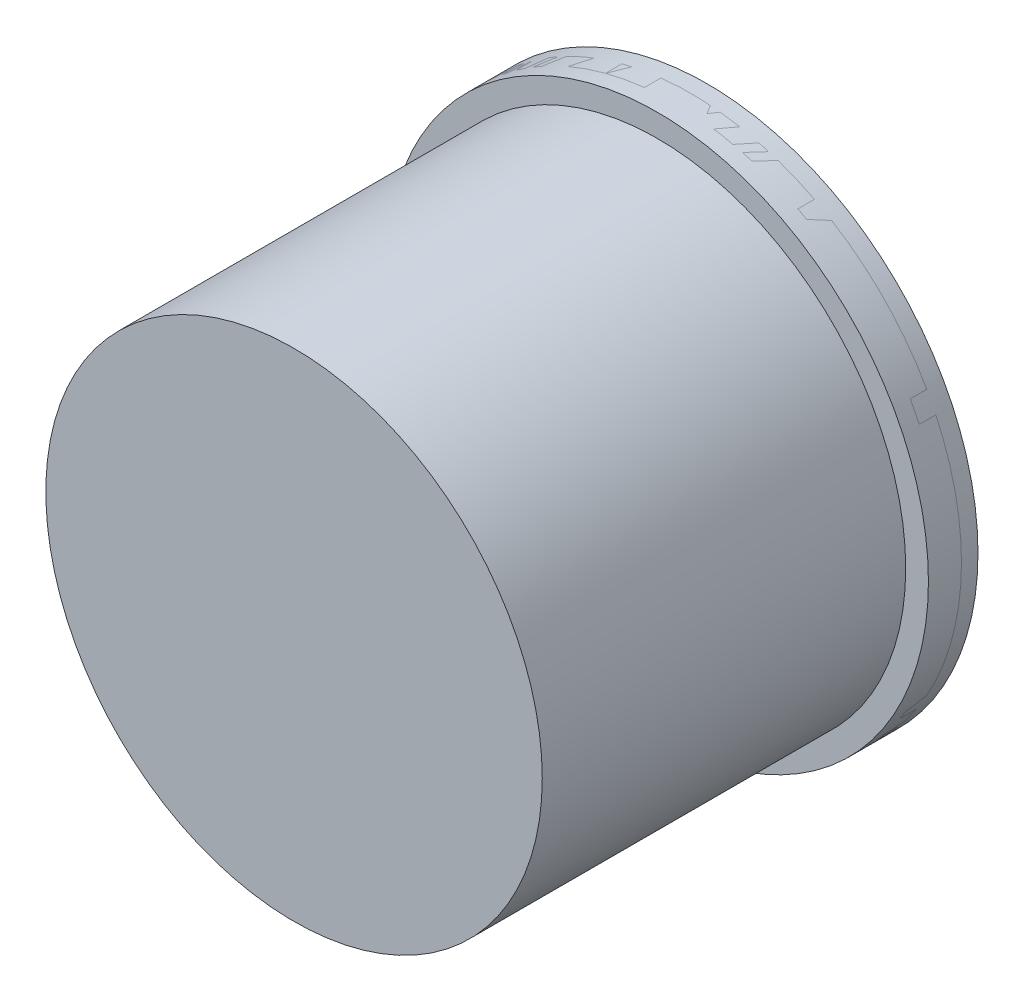
ISO-10303-21;
HEADER;
FILE_DESCRIPTION(('STEP AP214'),'2;1');
FILE_NAME('part.step','',(''),(''),'','','');
FILE_SCHEMA(('AUTOMOTIVE_DESIGN { 1 0 10303 214 1 1 1 1 }'));
ENDSEC;
DATA;
#1=APPLICATION_CONTEXT('core data for automotive mechanical design processes');
#2=APPLICATION_PROTOCOL_DEFINITION('international standard','automotive_design',2000,#1);
#3=PRODUCT_CONTEXT('',#1,'mechanical');
#4=PRODUCT('Part','Part','',(#3));
#5=PRODUCT_RELATED_PRODUCT_CATEGORY('part','',(#4));
#6=PRODUCT_DEFINITION_FORMATION('','',#4);
#7=PRODUCT_DEFINITION_CONTEXT('part definition',#1,'design');
#8=PRODUCT_DEFINITION('design','',#6,#7);
#9=PRODUCT_DEFINITION_SHAPE('','',#8);
#10=(LENGTH_UNIT() NAMED_UNIT(*) SI_UNIT(.MILLI.,.METRE.));
#11=(NAMED_UNIT(*) PLANE_ANGLE_UNIT() SI_UNIT($,.RADIAN.));
#12=(NAMED_UNIT(*) SI_UNIT($,.STERADIAN.) SOLID_ANGLE_UNIT());
#13=UNCERTAINTY_MEASURE_WITH_UNIT(LENGTH_MEASURE(1.E-05),#10,'distance_accuracy_value','');
#14=(GEOMETRIC_REPRESENTATION_CONTEXT(3) GLOBAL_UNCERTAINTY_ASSIGNED_CONTEXT((#13)) GLOBAL_UNIT_ASSIGNED_CONTEXT((#10,
#11,#12)) REPRESENTATION_CONTEXT('',''));
#15=CARTESIAN_POINT('',(0.,0.,0.));
#16=DIRECTION('',(0.,0.,1.));
#17=DIRECTION('',(1.,0.,0.));
#18=AXIS2_PLACEMENT_3D('',#15,#16,#17);
#19=CARTESIAN_POINT('',(0.,0.,-8.5));
#20=DIRECTION('',(0.,0.,1.));
#21=DIRECTION('',(1.,0.,0.));
#22=AXIS2_PLACEMENT_3D('',#19,#20,#21);
#23=CYLINDRICAL_SURFACE('',#22,16.4);
#24=CARTESIAN_POINT('',(0.,0.,-7.5));
#25=DIRECTION('',(0.,0.,-1.));
#26=DIRECTION('',(-1.,0.,0.));
#27=AXIS2_PLACEMENT_3D('',#24,#25,#26);
#28=CIRCLE('',#27,16.4);
#29=CARTESIAN_POINT('',(-16.4,0.,-7.5));
#30=VERTEX_POINT('',#29);
#31=EDGE_CURVE('P0_E47',#30,#30,#28,.T.);
#32=ORIENTED_EDGE('',*,*,#31,.F.);
#33=EDGE_LOOP('',(#32));
#34=FACE_BOUND('',#33,.T.);
#35=CARTESIAN_POINT('',(0.,0.,-5.5));
#36=DIRECTION('',(0.,0.,1.));
#37=DIRECTION('',(1.,0.,0.));
#38=AXIS2_PLACEMENT_3D('',#35,#36,#37);
#39=CIRCLE('',#38,16.4);
#40=CARTESIAN_POINT('',(16.4,0.,-5.5));
#41=VERTEX_POINT('',#40);
#42=EDGE_CURVE('P0_E61',#41,#41,#39,.T.);
#43=ORIENTED_EDGE('',*,*,#42,.F.);
#44=EDGE_LOOP('',(#43));
#45=FACE_BOUND('',#44,.T.);
#46=ADVANCED_FACE('P0_F44',(#34,#45),#23,.T.);
#47=CARTESIAN_POINT('',(0.,0.,-7.5));
#48=DIRECTION('',(0.,0.,-1.));
#49=DIRECTION('',(-1.,0.,0.));
#50=AXIS2_PLACEMENT_3D('',#47,#48,#49);
#51=PLANE('',#50);
#52=CARTESIAN_POINT('',(0.,0.,-7.5));
#53=DIRECTION('',(0.,0.,-1.));
#54=DIRECTION('',(-1.,0.,0.));
#55=AXIS2_PLACEMENT_3D('',#52,#53,#54);
#56=CIRCLE('',#55,6.05);
#57=CARTESIAN_POINT('',(-6.05,0.,-7.5));
#58=VERTEX_POINT('',#57);
#59=EDGE_CURVE('P0_E10',#58,#58,#56,.T.);
#60=ORIENTED_EDGE('',*,*,#59,.F.);
#61=EDGE_LOOP('',(#60));
#62=FACE_BOUND('',#61,.T.);
#63=ORIENTED_EDGE('',*,*,#31,.T.);
#64=EDGE_LOOP('',(#63));
#65=FACE_BOUND('',#64,.T.);
#66=ADVANCED_FACE('P0_F88',(#62,#65),#51,.T.);
#67=CARTESIAN_POINT('',(0.,0.,-13.));
#68=DIRECTION('',(0.,0.,1.));
#69=DIRECTION('',(1.,0.,0.));
#70=AXIS2_PLACEMENT_3D('',#67,#68,#69);
#71=CYLINDRICAL_SURFACE('',#70,6.05);
#72=CARTESIAN_POINT('',(0.,0.,-13.));
#73=DIRECTION('',(0.,0.,-1.));
#74=DIRECTION('',(-1.,0.,0.));
#75=AXIS2_PLACEMENT_3D('',#72,#73,#74);
#76=CIRCLE('',#75,6.05);
#77=CARTESIAN_POINT('',(-6.05,0.,-13.));
#78=VERTEX_POINT('',#77);
#79=EDGE_CURVE('P0_E54',#78,#78,#76,.T.);
#80=ORIENTED_EDGE('',*,*,#79,.F.);
#81=EDGE_LOOP('',(#80));
#82=FACE_BOUND('',#81,.T.);
#83=ORIENTED_EDGE('',*,*,#59,.T.);
#84=EDGE_LOOP('',(#83));
#85=FACE_BOUND('',#84,.T.);
#86=ADVANCED_FACE('P0_F83',(#82,#85),#71,.T.);
#87=CARTESIAN_POINT('',(0.,0.,-13.));
#88=DIRECTION('',(0.,0.,-1.));
#89=DIRECTION('',(-1.,0.,0.));
#90=AXIS2_PLACEMENT_3D('',#87,#88,#89);
#91=PLANE('',#90);
#92=ORIENTED_EDGE('',*,*,#79,.T.);
#93=EDGE_LOOP('',(#92));
#94=FACE_BOUND('',#93,.T.);
#95=ADVANCED_FACE('P0_F74',(#94),#91,.T.);
#96=CARTESIAN_POINT('',(0.,0.,-5.5));
#97=DIRECTION('',(0.,0.,1.));
#98=DIRECTION('',(1.,0.,0.));
#99=AXIS2_PLACEMENT_3D('',#96,#97,#98);
#100=PLANE('',#99);
#101=ORIENTED_EDGE('',*,*,#42,.T.);
#102=EDGE_LOOP('',(#101));
#103=FACE_BOUND('',#102,.T.);
#104=CARTESIAN_POINT('',(0.,0.,-5.5));
#105=DIRECTION('',(0.,0.,1.));
#106=DIRECTION('',(1.,0.,0.));
#107=AXIS2_PLACEMENT_3D('',#104,#105,#106);
#108=CIRCLE('',#107,15.025);
#109=CARTESIAN_POINT('',(15.025,0.,-5.5));
#110=VERTEX_POINT('',#109);
#111=EDGE_CURVE('P0_E64',#110,#110,#108,.T.);
#112=ORIENTED_EDGE('',*,*,#111,.F.);
#113=EDGE_LOOP('',(#112));
#114=FACE_BOUND('',#113,.T.);
#115=ADVANCED_FACE('P0_F71',(#103,#114),#100,.T.);
#116=CARTESIAN_POINT('',(0.,0.,16.5));
#117=DIRECTION('',(0.,0.,1.));
#118=DIRECTION('',(1.,0.,0.));
#119=AXIS2_PLACEMENT_3D('',#116,#117,#118);
#120=PLANE('',#119);
#121=CARTESIAN_POINT('',(0.,0.,16.5));
#122=DIRECTION('',(0.,0.,1.));
#123=DIRECTION('',(1.,0.,0.));
#124=AXIS2_PLACEMENT_3D('',#121,#122,#123);
#125=CIRCLE('',#124,15.025);
#126=CARTESIAN_POINT('',(15.025,0.,16.5));
#127=VERTEX_POINT('',#126);
#128=EDGE_CURVE('P0_E58',#127,#127,#125,.T.);
#129=ORIENTED_EDGE('',*,*,#128,.T.);
#130=EDGE_LOOP('',(#129));
#131=FACE_BOUND('',#130,.T.);
#132=ADVANCED_FACE('P0_F73',(#131),#120,.T.);
#133=CARTESIAN_POINT('',(0.,0.,16.5));
#134=DIRECTION('',(0.,0.,-1.));
#135=DIRECTION('',(-1.,0.,0.));
#136=AXIS2_PLACEMENT_3D('',#133,#134,#135);
#137=CYLINDRICAL_SURFACE('',#136,15.025);
#138=ORIENTED_EDGE('',*,*,#111,.T.);
#139=EDGE_LOOP('',(#138));
#140=FACE_BOUND('',#139,.T.);
#141=ORIENTED_EDGE('',*,*,#128,.F.);
#142=EDGE_LOOP('',(#141));
#143=FACE_BOUND('',#142,.T.);
#144=ADVANCED_FACE('P0_F68',(#140,#143),#137,.T.);
#145=CLOSED_SHELL('',(#46,#66,#86,#95,#115,#132,#144));
#146=MANIFOLD_SOLID_BREP('P0_B2',#145);
#147=CARTESIAN_POINT('',(0.,13.5,8.5));
#148=DIRECTION('',(0.,0.,1.));
#149=DIRECTION('',(1.,0.,0.));
#150=AXIS2_PLACEMENT_3D('',#147,#148,#149);
#151=CONICAL_SURFACE('',#150,1.25,0.785398162500002);
#152=CARTESIAN_POINT('',(0.,13.5,8.5));
#153=DIRECTION('',(0.,0.,-1.));
#154=DIRECTION('',(1.,0.,0.));
#155=AXIS2_PLACEMENT_3D('',#152,#153,#154);
#156=CIRCLE('',#155,1.25);
#157=CARTESIAN_POINT('',(1.25000000000005,13.5,8.5));
#158=VERTEX_POINT('',#157);
#159=EDGE_CURVE('P1_E20',#158,#158,#156,.T.);
#160=ORIENTED_EDGE('',*,*,#159,.F.);
#161=EDGE_LOOP('',(#160));
#162=FACE_BOUND('',#161,.T.);
#163=CARTESIAN_POINT('',(0.,13.5,8.275));
#164=DIRECTION('',(0.,0.,1.));
#165=DIRECTION('',(1.,0.,0.));
#166=AXIS2_PLACEMENT_3D('',#163,#164,#165);
#167=CIRCLE('',#166,1.025);
#168=CARTESIAN_POINT('',(1.02500000000005,13.5,8.275));
#169=VERTEX_POINT('',#168);
#170=EDGE_CURVE('P1_E11',#169,#169,#167,.T.);
#171=ORIENTED_EDGE('',*,*,#170,.F.);
#172=EDGE_LOOP('',(#171));
#173=FACE_BOUND('',#172,.T.);
#174=ADVANCED_FACE('P1_F16',(#162,#173),#151,.F.);
#175=CARTESIAN_POINT('',(0.,13.5,8.5));
#176=DIRECTION('',(0.,0.,-1.));
#177=DIRECTION('',(-1.,0.,0.));
#178=AXIS2_PLACEMENT_3D('',#175,#176,#177);
#179=CYLINDRICAL_SURFACE('',#178,1.025);
#180=CARTESIAN_POINT('',(0.,13.5,3.5));
#181=DIRECTION('',(0.,0.,1.));
#182=DIRECTION('',(-1.,0.,0.));
#183=AXIS2_PLACEMENT_3D('',#180,#181,#182);
#184=CIRCLE('',#183,1.025);
#185=CARTESIAN_POINT('',(-1.02499999999995,13.5,3.5));
#186=VERTEX_POINT('',#185);
#187=EDGE_CURVE('P1_E27',#186,#186,#184,.T.);
#188=ORIENTED_EDGE('',*,*,#187,.F.);
#189=EDGE_LOOP('',(#188));
#190=FACE_BOUND('',#189,.T.);
#191=ORIENTED_EDGE('',*,*,#170,.T.);
#192=EDGE_LOOP('',(#191));
#193=FACE_BOUND('',#192,.T.);
#194=ADVANCED_FACE('P1_F212',(#190,#193),#179,.F.);
#195=CARTESIAN_POINT('',(0.,13.5,3.5));
#196=DIRECTION('',(0.,0.,1.));
#197=DIRECTION('',(1.,0.,0.));
#198=AXIS2_PLACEMENT_3D('',#195,#196,#197);
#199=CONICAL_SURFACE('',#198,1.025,1.0297442575);
#200=CARTESIAN_POINT('',(0.,13.5,2.88411786549675));
#201=VERTEX_POINT('',#200);
#202=VERTEX_LOOP('',#201);
#203=FACE_BOUND('',#202,.T.);
#204=ORIENTED_EDGE('',*,*,#187,.T.);
#205=EDGE_LOOP('',(#204));
#206=FACE_BOUND('',#205,.T.);
#207=ADVANCED_FACE('P1_F218',(#203,#206),#199,.F.);
#208=CARTESIAN_POINT('',(13.5,0.,8.5));
#209=DIRECTION('',(0.,0.,1.));
#210=DIRECTION('',(1.,0.,0.));
#211=AXIS2_PLACEMENT_3D('',#208,#209,#210);
#212=CONICAL_SURFACE('',#211,1.25,0.7853981625);
#213=CARTESIAN_POINT('',(13.5,0.,8.5));
#214=DIRECTION('',(0.,0.,-1.));
#215=DIRECTION('',(1.,0.,0.));
#216=AXIS2_PLACEMENT_3D('',#213,#214,#215);
#217=CIRCLE('',#216,1.25);
#218=CARTESIAN_POINT('',(14.75,0.,8.5));
#219=VERTEX_POINT('',#218);
#220=EDGE_CURVE('P1_E167',#219,#219,#217,.T.);
#221=ORIENTED_EDGE('',*,*,#220,.F.);
#222=EDGE_LOOP('',(#221));
#223=FACE_BOUND('',#222,.T.);
#224=CARTESIAN_POINT('',(13.5,0.,8.275));
#225=DIRECTION('',(0.,0.,1.));
#226=DIRECTION('',(1.,0.,0.));
#227=AXIS2_PLACEMENT_3D('',#224,#225,#226);
#228=CIRCLE('',#227,1.025);
#229=CARTESIAN_POINT('',(14.525,0.,8.275));
#230=VERTEX_POINT('',#229);
#231=EDGE_CURVE('P1_E121',#230,#230,#228,.T.);
#232=ORIENTED_EDGE('',*,*,#231,.F.);
#233=EDGE_LOOP('',(#232));
#234=FACE_BOUND('',#233,.T.);
#235=ADVANCED_FACE('P1_F223',(#223,#234),#212,.F.);
#236=CARTESIAN_POINT('',(13.5,0.,8.5));
#237=DIRECTION('',(0.,0.,-1.));
#238=DIRECTION('',(-1.,0.,0.));
#239=AXIS2_PLACEMENT_3D('',#236,#237,#238);
#240=CYLINDRICAL_SURFACE('',#239,1.025);
#241=CARTESIAN_POINT('',(13.5,0.,3.5));
#242=DIRECTION('',(0.,0.,1.));
#243=DIRECTION('',(-1.,0.,0.));
#244=AXIS2_PLACEMENT_3D('',#241,#242,#243);
#245=CIRCLE('',#244,1.025);
#246=CARTESIAN_POINT('',(12.475,0.,3.5));
#247=VERTEX_POINT('',#246);
#248=EDGE_CURVE('P1_E125',#247,#247,#245,.T.);
#249=ORIENTED_EDGE('',*,*,#248,.F.);
#250=EDGE_LOOP('',(#249));
#251=FACE_BOUND('',#250,.T.);
#252=ORIENTED_EDGE('',*,*,#231,.T.);
#253=EDGE_LOOP('',(#252));
#254=FACE_BOUND('',#253,.T.);
#255=ADVANCED_FACE('P1_F122',(#251,#254),#240,.F.);
#256=CARTESIAN_POINT('',(13.5,0.,3.5));
#257=DIRECTION('',(0.,0.,1.));
#258=DIRECTION('',(1.,0.,0.));
#259=AXIS2_PLACEMENT_3D('',#256,#257,#258);
#260=CONICAL_SURFACE('',#259,1.025,1.0297442575);
#261=CARTESIAN_POINT('',(13.5,0.,2.88411786549675));
#262=VERTEX_POINT('',#261);
#263=VERTEX_LOOP('',#262);
#264=FACE_BOUND('',#263,.T.);
#265=ORIENTED_EDGE('',*,*,#248,.T.);
#266=EDGE_LOOP('',(#265));
#267=FACE_BOUND('',#266,.T.);
#268=ADVANCED_FACE('P1_F18',(#264,#267),#260,.F.);
#269=CARTESIAN_POINT('',(0.,-13.5,8.5));
#270=DIRECTION('',(0.,0.,1.));
#271=DIRECTION('',(1.,0.,0.));
#272=AXIS2_PLACEMENT_3D('',#269,#270,#271);
#273=CONICAL_SURFACE('',#272,1.25,0.785398162500002);
#274=CARTESIAN_POINT('',(0.,-13.5,8.5));
#275=DIRECTION('',(0.,0.,-1.));
#276=DIRECTION('',(1.,0.,0.));
#277=AXIS2_PLACEMENT_3D('',#274,#275,#276);
#278=CIRCLE('',#277,1.25);
#279=CARTESIAN_POINT('',(1.24999999999998,-13.5,8.5));
#280=VERTEX_POINT('',#279);
#281=EDGE_CURVE('P1_E165',#280,#280,#278,.T.);
#282=ORIENTED_EDGE('',*,*,#281,.F.);
#283=EDGE_LOOP('',(#282));
#284=FACE_BOUND('',#283,.T.);
#285=CARTESIAN_POINT('',(0.,-13.5,8.275));
#286=DIRECTION('',(0.,0.,1.));
#287=DIRECTION('',(1.,0.,0.));
#288=AXIS2_PLACEMENT_3D('',#285,#286,#287);
#289=CIRCLE('',#288,1.025);
#290=CARTESIAN_POINT('',(1.02499999999998,-13.5,8.275));
#291=VERTEX_POINT('',#290);
#292=EDGE_CURVE('P1_E133',#291,#291,#289,.T.);
#293=ORIENTED_EDGE('',*,*,#292,.F.);
#294=EDGE_LOOP('',(#293));
#295=FACE_BOUND('',#294,.T.);
#296=ADVANCED_FACE('P1_F241',(#284,#295),#273,.F.);
#297=CARTESIAN_POINT('',(0.,-13.5,8.5));
#298=DIRECTION('',(0.,0.,-1.));
#299=DIRECTION('',(-1.,0.,0.));
#300=AXIS2_PLACEMENT_3D('',#297,#298,#299);
#301=CYLINDRICAL_SURFACE('',#300,1.025);
#302=CARTESIAN_POINT('',(0.,-13.5,3.5));
#303=DIRECTION('',(0.,0.,1.));
#304=DIRECTION('',(-1.,0.,0.));
#305=AXIS2_PLACEMENT_3D('',#302,#303,#304);
#306=CIRCLE('',#305,1.025);
#307=CARTESIAN_POINT('',(-1.02500000000002,-13.5,3.5));
#308=VERTEX_POINT('',#307);
#309=EDGE_CURVE('P1_E161',#308,#308,#306,.T.);
#310=ORIENTED_EDGE('',*,*,#309,.F.);
#311=EDGE_LOOP('',(#310));
#312=FACE_BOUND('',#311,.T.);
#313=ORIENTED_EDGE('',*,*,#292,.T.);
#314=EDGE_LOOP('',(#313));
#315=FACE_BOUND('',#314,.T.);
#316=ADVANCED_FACE('P1_F237',(#312,#315),#301,.F.);
#317=CARTESIAN_POINT('',(0.,-13.5,3.5));
#318=DIRECTION('',(0.,0.,1.));
#319=DIRECTION('',(1.,0.,0.));
#320=AXIS2_PLACEMENT_3D('',#317,#318,#319);
#321=CONICAL_SURFACE('',#320,1.025,1.0297442575);
#322=CARTESIAN_POINT('',(0.,-13.5,2.88411786549675));
#323=VERTEX_POINT('',#322);
#324=VERTEX_LOOP('',#323);
#325=FACE_BOUND('',#324,.T.);
#326=ORIENTED_EDGE('',*,*,#309,.T.);
#327=EDGE_LOOP('',(#326));
#328=FACE_BOUND('',#327,.T.);
#329=ADVANCED_FACE('P1_F240',(#325,#328),#321,.F.);
#330=CARTESIAN_POINT('',(-13.5,0.,8.5));
#331=DIRECTION('',(0.,0.,1.));
#332=DIRECTION('',(1.,0.,0.));
#333=AXIS2_PLACEMENT_3D('',#330,#331,#332);
#334=CONICAL_SURFACE('',#333,1.25,0.7853981625);
#335=CARTESIAN_POINT('',(-13.5,0.,8.5));
#336=DIRECTION('',(0.,0.,-1.));
#337=DIRECTION('',(1.,0.,0.));
#338=AXIS2_PLACEMENT_3D('',#335,#336,#337);
#339=CIRCLE('',#338,1.25);
#340=CARTESIAN_POINT('',(-12.25,0.,8.5));
#341=VERTEX_POINT('',#340);
#342=EDGE_CURVE('P1_E157',#341,#341,#339,.T.);
#343=ORIENTED_EDGE('',*,*,#342,.F.);
#344=EDGE_LOOP('',(#343));
#345=FACE_BOUND('',#344,.T.);
#346=CARTESIAN_POINT('',(-13.5,0.,8.275));
#347=DIRECTION('',(0.,0.,1.));
#348=DIRECTION('',(1.,0.,0.));
#349=AXIS2_PLACEMENT_3D('',#346,#347,#348);
#350=CIRCLE('',#349,1.025);
#351=CARTESIAN_POINT('',(-12.475,0.,8.275));
#352=VERTEX_POINT('',#351);
#353=EDGE_CURVE('P1_E162',#352,#352,#350,.T.);
#354=ORIENTED_EDGE('',*,*,#353,.F.);
#355=EDGE_LOOP('',(#354));
#356=FACE_BOUND('',#355,.T.);
#357=ADVANCED_FACE('P1_F322',(#345,#356),#334,.F.);
#358=CARTESIAN_POINT('',(-13.5,0.,8.5));
#359=DIRECTION('',(0.,0.,-1.));
#360=DIRECTION('',(-1.,0.,0.));
#361=AXIS2_PLACEMENT_3D('',#358,#359,#360);
#362=CYLINDRICAL_SURFACE('',#361,1.025);
#363=CARTESIAN_POINT('',(-13.5,0.,3.5));
#364=DIRECTION('',(0.,0.,1.));
#365=DIRECTION('',(-1.,0.,0.));
#366=AXIS2_PLACEMENT_3D('',#363,#364,#365);
#367=CIRCLE('',#366,1.025);
#368=CARTESIAN_POINT('',(-14.525,0.,3.5));
#369=VERTEX_POINT('',#368);
#370=EDGE_CURVE('P1_E164',#369,#369,#367,.T.);
#371=ORIENTED_EDGE('',*,*,#370,.F.);
#372=EDGE_LOOP('',(#371));
#373=FACE_BOUND('',#372,.T.);
#374=ORIENTED_EDGE('',*,*,#353,.T.);
#375=EDGE_LOOP('',(#374));
#376=FACE_BOUND('',#375,.T.);
#377=ADVANCED_FACE('P1_F330',(#373,#376),#362,.F.);
#378=CARTESIAN_POINT('',(-13.5,0.,3.5));
#379=DIRECTION('',(0.,0.,1.));
#380=DIRECTION('',(1.,0.,0.));
#381=AXIS2_PLACEMENT_3D('',#378,#379,#380);
#382=CONICAL_SURFACE('',#381,1.025,1.0297442575);
#383=CARTESIAN_POINT('',(-13.5,0.,2.88411786549675));
#384=VERTEX_POINT('',#383);
#385=VERTEX_LOOP('',#384);
#386=FACE_BOUND('',#385,.T.);
#387=ORIENTED_EDGE('',*,*,#370,.T.);
#388=EDGE_LOOP('',(#387));
#389=FACE_BOUND('',#388,.T.);
#390=ADVANCED_FACE('P1_F262',(#386,#389),#382,.F.);
#391=CARTESIAN_POINT('',(0.,0.,-2.5));
#392=DIRECTION('',(0.,0.,-1.));
#393=DIRECTION('',(-1.,0.,0.));
#394=AXIS2_PLACEMENT_3D('',#391,#392,#393);
#395=CYLINDRICAL_SURFACE('',#394,12.);
#396=CARTESIAN_POINT('',(0.,0.,-8.5));
#397=DIRECTION('',(0.,0.,-1.));
#398=DIRECTION('',(1.,0.,0.));
#399=AXIS2_PLACEMENT_3D('',#396,#397,#398);
#400=CIRCLE('',#399,12.);
#401=CARTESIAN_POINT('',(12.,0.,-8.5));
#402=VERTEX_POINT('',#401);
#403=EDGE_CURVE('P1_E139',#402,#402,#400,.T.);
#404=ORIENTED_EDGE('',*,*,#403,.T.);
#405=EDGE_LOOP('',(#404));
#406=FACE_BOUND('',#405,.T.);
#407=CARTESIAN_POINT('',(0.,0.,-2.5));
#408=DIRECTION('',(0.,0.,1.));
#409=DIRECTION('',(1.,0.,0.));
#410=AXIS2_PLACEMENT_3D('',#407,#408,#409);
#411=CIRCLE('',#410,12.);
#412=CARTESIAN_POINT('',(12.,0.,-2.5));
#413=VERTEX_POINT('',#412);
#414=EDGE_CURVE('P1_E265',#413,#413,#411,.T.);
#415=ORIENTED_EDGE('',*,*,#414,.T.);
#416=EDGE_LOOP('',(#415));
#417=FACE_BOUND('',#416,.T.);
#418=ADVANCED_FACE('P1_F259',(#406,#417),#395,.F.);
#419=CARTESIAN_POINT('',(0.,0.,-2.5));
#420=DIRECTION('',(0.,0.,-1.));
#421=DIRECTION('',(0.,-1.,0.));
#422=AXIS2_PLACEMENT_3D('',#419,#420,#421);
#423=PLANE('',#422);
#424=CARTESIAN_POINT('',(0.,0.,-2.5));
#425=DIRECTION('',(0.,0.,1.));
#426=DIRECTION('',(-1.,0.,0.));
#427=AXIS2_PLACEMENT_3D('',#424,#425,#426);
#428=CIRCLE('',#427,11.);
#429=CARTESIAN_POINT('',(-11.,0.,-2.5));
#430=VERTEX_POINT('',#429);
#431=EDGE_CURVE('P1_E177',#430,#430,#428,.T.);
#432=ORIENTED_EDGE('',*,*,#431,.T.);
#433=EDGE_LOOP('',(#432));
#434=FACE_BOUND('',#433,.T.);
#435=ORIENTED_EDGE('',*,*,#414,.F.);
#436=EDGE_LOOP('',(#435));
#437=FACE_BOUND('',#436,.T.);
#438=ADVANCED_FACE('P1_F232',(#434,#437),#423,.T.);
#439=CARTESIAN_POINT('',(0.,0.,2.5));
#440=DIRECTION('',(0.,0.,1.));
#441=DIRECTION('',(1.,0.,0.));
#442=AXIS2_PLACEMENT_3D('',#439,#440,#441);
#443=CYLINDRICAL_SURFACE('',#442,12.);
#444=CARTESIAN_POINT('',(0.,0.,8.5));
#445=DIRECTION('',(0.,0.,1.));
#446=DIRECTION('',(1.,0.,0.));
#447=AXIS2_PLACEMENT_3D('',#444,#445,#446);
#448=CIRCLE('',#447,12.);
#449=CARTESIAN_POINT('',(12.,0.,8.5));
#450=VERTEX_POINT('',#449);
#451=EDGE_CURVE('P1_E149',#450,#450,#448,.T.);
#452=ORIENTED_EDGE('',*,*,#451,.T.);
#453=EDGE_LOOP('',(#452));
#454=FACE_BOUND('',#453,.T.);
#455=CARTESIAN_POINT('',(0.,0.,2.5));
#456=DIRECTION('',(0.,0.,-1.));
#457=DIRECTION('',(1.,0.,0.));
#458=AXIS2_PLACEMENT_3D('',#455,#456,#457);
#459=CIRCLE('',#458,12.);
#460=CARTESIAN_POINT('',(12.,0.,2.5));
#461=VERTEX_POINT('',#460);
#462=EDGE_CURVE('P1_E146',#461,#461,#459,.T.);
#463=ORIENTED_EDGE('',*,*,#462,.T.);
#464=EDGE_LOOP('',(#463));
#465=FACE_BOUND('',#464,.T.);
#466=ADVANCED_FACE('P1_F229',(#454,#465),#443,.F.);
#467=CARTESIAN_POINT('',(0.,0.,2.5));
#468=DIRECTION('',(0.,0.,1.));
#469=DIRECTION('',(1.,0.,0.));
#470=AXIS2_PLACEMENT_3D('',#467,#468,#469);
#471=PLANE('',#470);
#472=CARTESIAN_POINT('',(0.,0.,2.5));
#473=DIRECTION('',(0.,0.,-1.));
#474=DIRECTION('',(1.,0.,0.));
#475=AXIS2_PLACEMENT_3D('',#472,#473,#474);
#476=CIRCLE('',#475,11.);
#477=CARTESIAN_POINT('',(11.,0.,2.5));
#478=VERTEX_POINT('',#477);
#479=EDGE_CURVE('P1_E183',#478,#478,#476,.T.);
#480=ORIENTED_EDGE('',*,*,#479,.T.);
#481=EDGE_LOOP('',(#480));
#482=FACE_BOUND('',#481,.T.);
#483=ORIENTED_EDGE('',*,*,#462,.F.);
#484=EDGE_LOOP('',(#483));
#485=FACE_BOUND('',#484,.T.);
#486=ADVANCED_FACE('P1_F193',(#482,#485),#471,.T.);
#487=CARTESIAN_POINT('',(0.,0.,-6.5));
#488=DIRECTION('',(0.,0.,-1.));
#489=DIRECTION('',(0.,-1.,0.));
#490=AXIS2_PLACEMENT_3D('',#487,#488,#489);
#491=PLANE('',#490);
#492=CARTESIAN_POINT('',(0.,0.,-6.5));
#493=DIRECTION('',(0.,0.,-1.));
#494=DIRECTION('',(1.,0.,0.));
#495=AXIS2_PLACEMENT_3D('',#492,#493,#494);
#496=CIRCLE('',#495,16.4);
#497=CARTESIAN_POINT('',(16.4,0.,-6.5));
#498=VERTEX_POINT('',#497);
#499=EDGE_CURVE('P1_E137',#498,#498,#496,.T.);
#500=ORIENTED_EDGE('',*,*,#499,.F.);
#501=EDGE_LOOP('',(#500));
#502=FACE_BOUND('',#501,.T.);
#503=CARTESIAN_POINT('',(0.,0.,-6.5));
#504=DIRECTION('',(0.,0.,1.));
#505=DIRECTION('',(1.,0.,0.));
#506=AXIS2_PLACEMENT_3D('',#503,#504,#505);
#507=CIRCLE('',#506,15.);
#508=CARTESIAN_POINT('',(15.,0.,-6.5));
#509=VERTEX_POINT('',#508);
#510=EDGE_CURVE('P1_E171',#509,#509,#507,.T.);
#511=ORIENTED_EDGE('',*,*,#510,.F.);
#512=EDGE_LOOP('',(#511));
#513=FACE_BOUND('',#512,.T.);
#514=ADVANCED_FACE('P1_F245',(#502,#513),#491,.F.);
#515=CARTESIAN_POINT('',(0.,0.,-8.5));
#516=DIRECTION('',(0.,0.,-1.));
#517=DIRECTION('',(0.,-1.,0.));
#518=AXIS2_PLACEMENT_3D('',#515,#516,#517);
#519=PLANE('',#518);
#520=CARTESIAN_POINT('',(0.,0.,-8.5));
#521=DIRECTION('',(0.,0.,-1.));
#522=DIRECTION('',(1.,0.,0.));
#523=AXIS2_PLACEMENT_3D('',#520,#521,#522);
#524=CIRCLE('',#523,16.4);
#525=CARTESIAN_POINT('',(16.4,0.,-8.5));
#526=VERTEX_POINT('',#525);
#527=EDGE_CURVE('P1_E140',#526,#526,#524,.T.);
#528=ORIENTED_EDGE('',*,*,#527,.T.);
#529=EDGE_LOOP('',(#528));
#530=FACE_BOUND('',#529,.T.);
#531=ORIENTED_EDGE('',*,*,#403,.F.);
#532=EDGE_LOOP('',(#531));
#533=FACE_BOUND('',#532,.T.);
#534=ADVANCED_FACE('P1_F246',(#530,#533),#519,.T.);
#535=CARTESIAN_POINT('',(0.,0.,-8.5));
#536=DIRECTION('',(0.,0.,1.));
#537=DIRECTION('',(1.,0.,0.));
#538=AXIS2_PLACEMENT_3D('',#535,#536,#537);
#539=CYLINDRICAL_SURFACE('',#538,16.4);
#540=ORIENTED_EDGE('',*,*,#499,.T.);
#541=EDGE_LOOP('',(#540));
#542=FACE_BOUND('',#541,.T.);
#543=ORIENTED_EDGE('',*,*,#527,.F.);
#544=EDGE_LOOP('',(#543));
#545=FACE_BOUND('',#544,.T.);
#546=ADVANCED_FACE('P1_F248',(#542,#545),#539,.T.);
#547=CARTESIAN_POINT('',(0.,0.,8.5));
#548=DIRECTION('',(0.,0.,1.));
#549=DIRECTION('',(1.,0.,0.));
#550=AXIS2_PLACEMENT_3D('',#547,#548,#549);
#551=PLANE('',#550);
#552=CARTESIAN_POINT('',(0.,0.,8.5));
#553=DIRECTION('',(0.,0.,1.));
#554=DIRECTION('',(1.,0.,0.));
#555=AXIS2_PLACEMENT_3D('',#552,#553,#554);
#556=CIRCLE('',#555,15.);
#557=CARTESIAN_POINT('',(15.,0.,8.5));
#558=VERTEX_POINT('',#557);
#559=EDGE_CURVE('P1_E168',#558,#558,#556,.T.);
#560=ORIENTED_EDGE('',*,*,#559,.T.);
#561=EDGE_LOOP('',(#560));
#562=FACE_BOUND('',#561,.T.);
#563=ORIENTED_EDGE('',*,*,#451,.F.);
#564=EDGE_LOOP('',(#563));
#565=FACE_BOUND('',#564,.T.);
#566=ORIENTED_EDGE('',*,*,#342,.T.);
#567=EDGE_LOOP('',(#566));
#568=FACE_BOUND('',#567,.T.);
#569=ORIENTED_EDGE('',*,*,#281,.T.);
#570=EDGE_LOOP('',(#569));
#571=FACE_BOUND('',#570,.T.);
#572=ORIENTED_EDGE('',*,*,#220,.T.);
#573=EDGE_LOOP('',(#572));
#574=FACE_BOUND('',#573,.T.);
#575=ORIENTED_EDGE('',*,*,#159,.T.);
#576=EDGE_LOOP('',(#575));
#577=FACE_BOUND('',#576,.T.);
#578=ADVANCED_FACE('P1_F205',(#562,#565,#568,#571,#574,#577),#551,.T.);
#579=CARTESIAN_POINT('',(0.,0.,-6.5));
#580=DIRECTION('',(0.,0.,1.));
#581=DIRECTION('',(1.,0.,0.));
#582=AXIS2_PLACEMENT_3D('',#579,#580,#581);
#583=CYLINDRICAL_SURFACE('',#582,15.);
#584=ORIENTED_EDGE('',*,*,#559,.F.);
#585=EDGE_LOOP('',(#584));
#586=FACE_BOUND('',#585,.T.);
#587=ORIENTED_EDGE('',*,*,#510,.T.);
#588=EDGE_LOOP('',(#587));
#589=FACE_BOUND('',#588,.T.);
#590=ADVANCED_FACE('P1_F198',(#586,#589),#583,.T.);
#591=CARTESIAN_POINT('',(0.,0.,-6.5));
#592=DIRECTION('',(0.,0.,1.));
#593=DIRECTION('',(1.,0.,0.));
#594=AXIS2_PLACEMENT_3D('',#591,#592,#593);
#595=CYLINDRICAL_SURFACE('',#594,11.);
#596=ORIENTED_EDGE('',*,*,#431,.F.);
#597=EDGE_LOOP('',(#596));
#598=FACE_BOUND('',#597,.T.);
#599=ORIENTED_EDGE('',*,*,#479,.F.);
#600=EDGE_LOOP('',(#599));
#601=FACE_BOUND('',#600,.T.);
#602=ADVANCED_FACE('P1_F196',(#598,#601),#595,.F.);
#603=CLOSED_SHELL('',(#174,#194,#207,#235,#255,#268,#296,#316,#329,#357,#377,#390,#418,#438,
#466,#486,#514,#534,#546,#578,#590,#602));
#604=MANIFOLD_SOLID_BREP('P1_B1',#603);
#605=ADVANCED_BREP_SHAPE_REPRESENTATION('',(#18,#146,#604),#14);
#606=SHAPE_DEFINITION_REPRESENTATION(#9,#605);
ENDSEC;
END-ISO-10303-21;
